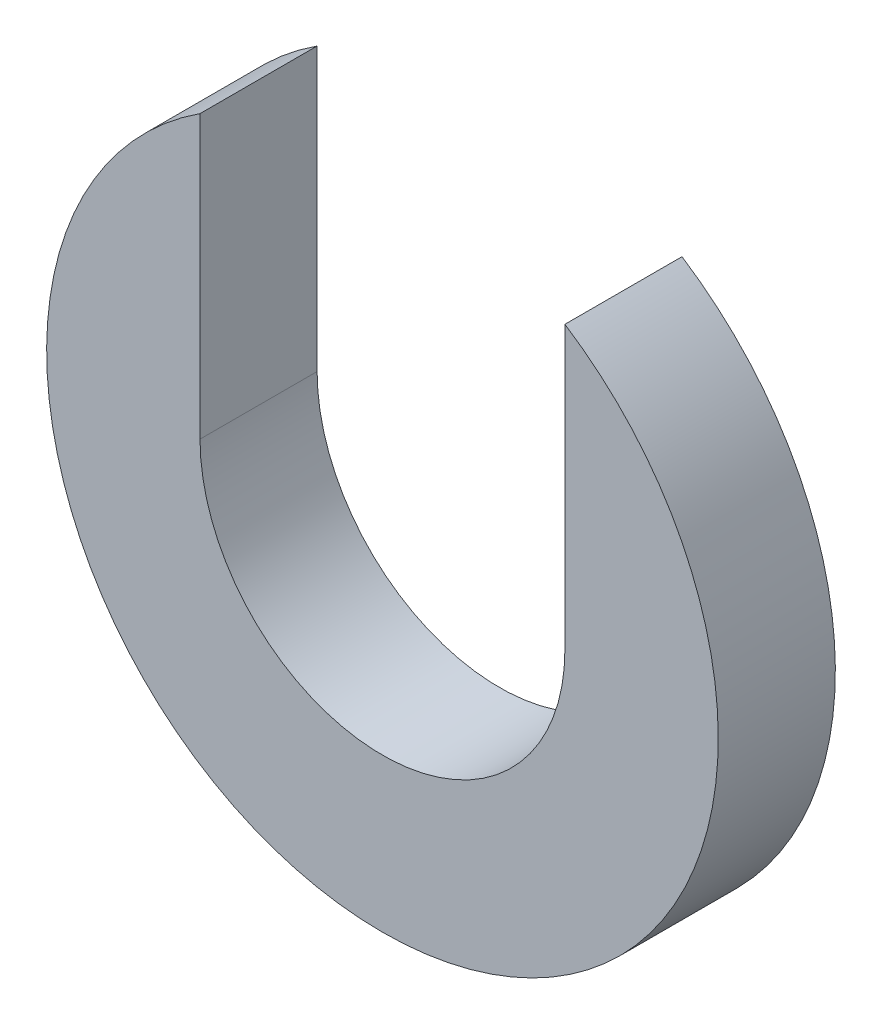
ISO-10303-21;
HEADER;
FILE_DESCRIPTION(('STEP AP214'),'2;1');
FILE_NAME('part.step','',(''),(''),'','','');
FILE_SCHEMA(('AUTOMOTIVE_DESIGN { 1 0 10303 214 1 1 1 1 }'));
ENDSEC;
DATA;
#1=APPLICATION_CONTEXT('core data for automotive mechanical design processes');
#2=APPLICATION_PROTOCOL_DEFINITION('international standard','automotive_design',2000,#1);
#3=PRODUCT_CONTEXT('',#1,'mechanical');
#4=PRODUCT('Part','Part','',(#3));
#5=PRODUCT_RELATED_PRODUCT_CATEGORY('part','',(#4));
#6=PRODUCT_DEFINITION_FORMATION('','',#4);
#7=PRODUCT_DEFINITION_CONTEXT('part definition',#1,'design');
#8=PRODUCT_DEFINITION('design','',#6,#7);
#9=PRODUCT_DEFINITION_SHAPE('','',#8);
#10=(LENGTH_UNIT() NAMED_UNIT(*) SI_UNIT(.MILLI.,.METRE.));
#11=(NAMED_UNIT(*) PLANE_ANGLE_UNIT() SI_UNIT($,.RADIAN.));
#12=(NAMED_UNIT(*) SI_UNIT($,.STERADIAN.) SOLID_ANGLE_UNIT());
#13=UNCERTAINTY_MEASURE_WITH_UNIT(LENGTH_MEASURE(1.E-05),#10,'distance_accuracy_value','');
#14=(GEOMETRIC_REPRESENTATION_CONTEXT(3) GLOBAL_UNCERTAINTY_ASSIGNED_CONTEXT((#13)) GLOBAL_UNIT_ASSIGNED_CONTEXT((#10,
#11,#12)) REPRESENTATION_CONTEXT('',''));
#15=CARTESIAN_POINT('',(0.,0.,0.));
#16=DIRECTION('',(0.,0.,1.));
#17=DIRECTION('',(1.,0.,0.));
#18=AXIS2_PLACEMENT_3D('',#15,#16,#17);
#19=CARTESIAN_POINT('',(0.,0.,3.18));
#20=DIRECTION('',(0.,0.,-1.));
#21=DIRECTION('',(-1.,0.,0.));
#22=AXIS2_PLACEMENT_3D('',#19,#20,#21);
#23=CYLINDRICAL_SURFACE('',#22,9.12);
#24=CARTESIAN_POINT('',(0.,0.,3.18));
#25=DIRECTION('',(0.,0.,1.));
#26=DIRECTION('',(1.,0.,0.));
#27=AXIS2_PLACEMENT_3D('',#24,#25,#26);
#28=CIRCLE('',#27,9.12);
#29=CARTESIAN_POINT('',(-4.955,7.6565249950614,3.18));
#30=VERTEX_POINT('',#29);
#31=CARTESIAN_POINT('',(4.955,7.6565249950614,3.18));
#32=VERTEX_POINT('',#31);
#33=EDGE_CURVE('E11',#30,#32,#28,.T.);
#34=ORIENTED_EDGE('',*,*,#33,.F.);
#35=DIRECTION('',(0.,0.,1.));
#36=VECTOR('',#35,1.);
#37=CARTESIAN_POINT('',(-4.955,7.6565249950614,0.));
#38=LINE('',#37,#36);
#39=CARTESIAN_POINT('',(-4.955,7.6565249950614,0.));
#40=VERTEX_POINT('',#39);
#41=EDGE_CURVE('E66',#40,#30,#38,.T.);
#42=ORIENTED_EDGE('',*,*,#41,.F.);
#43=CARTESIAN_POINT('',(0.,0.,0.));
#44=DIRECTION('',(0.,0.,1.));
#45=DIRECTION('',(1.,0.,0.));
#46=AXIS2_PLACEMENT_3D('',#43,#44,#45);
#47=CIRCLE('',#46,9.12);
#48=CARTESIAN_POINT('',(4.955,7.6565249950614,0.));
#49=VERTEX_POINT('',#48);
#50=EDGE_CURVE('E43',#40,#49,#47,.T.);
#51=ORIENTED_EDGE('',*,*,#50,.T.);
#52=DIRECTION('',(0.,0.,1.));
#53=VECTOR('',#52,1.);
#54=CARTESIAN_POINT('',(4.955,7.6565249950614,0.));
#55=LINE('',#54,#53);
#56=EDGE_CURVE('E52',#49,#32,#55,.T.);
#57=ORIENTED_EDGE('',*,*,#56,.T.);
#58=EDGE_LOOP('',(#34,#42,#51,#57));
#59=FACE_BOUND('',#58,.T.);
#60=ADVANCED_FACE('F34',(#59),#23,.T.);
#61=CARTESIAN_POINT('',(0.,0.,3.18));
#62=DIRECTION('',(0.,0.,1.));
#63=DIRECTION('',(1.,0.,0.));
#64=AXIS2_PLACEMENT_3D('',#61,#62,#63);
#65=PLANE('',#64);
#66=DIRECTION('',(0.,1.,0.));
#67=VECTOR('',#66,1.);
#68=CARTESIAN_POINT('',(-4.955,0.,3.18));
#69=LINE('',#68,#67);
#70=CARTESIAN_POINT('',(-4.955,0.,3.18));
#71=VERTEX_POINT('',#70);
#72=EDGE_CURVE('E70',#30,#71,#69,.F.);
#73=ORIENTED_EDGE('',*,*,#72,.F.);
#74=ORIENTED_EDGE('',*,*,#33,.T.);
#75=DIRECTION('',(0.,1.,0.));
#76=VECTOR('',#75,1.);
#77=CARTESIAN_POINT('',(4.955,0.,3.18));
#78=LINE('',#77,#76);
#79=CARTESIAN_POINT('',(4.955,0.,3.18));
#80=VERTEX_POINT('',#79);
#81=EDGE_CURVE('E86',#80,#32,#78,.T.);
#82=ORIENTED_EDGE('',*,*,#81,.F.);
#83=CARTESIAN_POINT('',(0.,0.,3.18));
#84=DIRECTION('',(0.,0.,1.));
#85=DIRECTION('',(1.,0.,0.));
#86=AXIS2_PLACEMENT_3D('',#83,#84,#85);
#87=CIRCLE('',#86,4.955);
#88=EDGE_CURVE('E37',#71,#80,#87,.T.);
#89=ORIENTED_EDGE('',*,*,#88,.F.);
#90=EDGE_LOOP('',(#73,#74,#82,#89));
#91=FACE_BOUND('',#90,.T.);
#92=ADVANCED_FACE('F83',(#91),#65,.T.);
#93=CARTESIAN_POINT('',(0.,0.,0.));
#94=DIRECTION('',(0.,0.,1.));
#95=DIRECTION('',(1.,0.,0.));
#96=AXIS2_PLACEMENT_3D('',#93,#94,#95);
#97=PLANE('',#96);
#98=ORIENTED_EDGE('',*,*,#50,.F.);
#99=DIRECTION('',(0.,-1.,0.));
#100=VECTOR('',#99,1.);
#101=CARTESIAN_POINT('',(-4.955,0.,0.));
#102=LINE('',#101,#100);
#103=CARTESIAN_POINT('',(-4.955,0.,0.));
#104=VERTEX_POINT('',#103);
#105=EDGE_CURVE('E74',#40,#104,#102,.T.);
#106=ORIENTED_EDGE('',*,*,#105,.T.);
#107=CARTESIAN_POINT('',(0.,0.,0.));
#108=DIRECTION('',(0.,0.,1.));
#109=DIRECTION('',(1.,0.,0.));
#110=AXIS2_PLACEMENT_3D('',#107,#108,#109);
#111=CIRCLE('',#110,4.955);
#112=CARTESIAN_POINT('',(4.955,0.,0.));
#113=VERTEX_POINT('',#112);
#114=EDGE_CURVE('E100',#104,#113,#111,.T.);
#115=ORIENTED_EDGE('',*,*,#114,.T.);
#116=DIRECTION('',(0.,1.,0.));
#117=VECTOR('',#116,1.);
#118=CARTESIAN_POINT('',(4.955,0.,0.));
#119=LINE('',#118,#117);
#120=EDGE_CURVE('E98',#113,#49,#119,.T.);
#121=ORIENTED_EDGE('',*,*,#120,.T.);
#122=EDGE_LOOP('',(#98,#106,#115,#121));
#123=FACE_BOUND('',#122,.T.);
#124=ADVANCED_FACE('F104',(#123),#97,.F.);
#125=CARTESIAN_POINT('',(0.,0.,0.));
#126=DIRECTION('',(0.,0.,1.));
#127=DIRECTION('',(1.,0.,0.));
#128=AXIS2_PLACEMENT_3D('',#125,#126,#127);
#129=CYLINDRICAL_SURFACE('',#128,4.955);
#130=ORIENTED_EDGE('',*,*,#88,.T.);
#131=DIRECTION('',(0.,0.,1.));
#132=VECTOR('',#131,1.);
#133=CARTESIAN_POINT('',(4.955,0.,0.));
#134=LINE('',#133,#132);
#135=EDGE_CURVE('E87',#113,#80,#134,.T.);
#136=ORIENTED_EDGE('',*,*,#135,.F.);
#137=ORIENTED_EDGE('',*,*,#114,.F.);
#138=DIRECTION('',(0.,0.,1.));
#139=VECTOR('',#138,1.);
#140=CARTESIAN_POINT('',(-4.955,0.,0.));
#141=LINE('',#140,#139);
#142=EDGE_CURVE('E79',#104,#71,#141,.T.);
#143=ORIENTED_EDGE('',*,*,#142,.T.);
#144=EDGE_LOOP('',(#130,#136,#137,#143));
#145=FACE_BOUND('',#144,.T.);
#146=ADVANCED_FACE('F107',(#145),#129,.F.);
#147=CARTESIAN_POINT('',(-4.955,0.,0.));
#148=DIRECTION('',(-1.,0.,0.));
#149=DIRECTION('',(0.,0.,1.));
#150=AXIS2_PLACEMENT_3D('',#147,#148,#149);
#151=PLANE('',#150);
#152=ORIENTED_EDGE('',*,*,#72,.T.);
#153=ORIENTED_EDGE('',*,*,#142,.F.);
#154=ORIENTED_EDGE('',*,*,#105,.F.);
#155=ORIENTED_EDGE('',*,*,#41,.T.);
#156=EDGE_LOOP('',(#152,#153,#154,#155));
#157=FACE_BOUND('',#156,.T.);
#158=ADVANCED_FACE('F68',(#157),#151,.F.);
#159=CARTESIAN_POINT('',(4.955,0.,0.));
#160=DIRECTION('',(1.,0.,0.));
#161=DIRECTION('',(0.,0.,-1.));
#162=AXIS2_PLACEMENT_3D('',#159,#160,#161);
#163=PLANE('',#162);
#164=ORIENTED_EDGE('',*,*,#81,.T.);
#165=ORIENTED_EDGE('',*,*,#56,.F.);
#166=ORIENTED_EDGE('',*,*,#120,.F.);
#167=ORIENTED_EDGE('',*,*,#135,.T.);
#168=EDGE_LOOP('',(#164,#165,#166,#167));
#169=FACE_BOUND('',#168,.T.);
#170=ADVANCED_FACE('F108',(#169),#163,.F.);
#171=CLOSED_SHELL('',(#60,#92,#124,#146,#158,#170));
#172=MANIFOLD_SOLID_BREP('B2',#171);
#173=ADVANCED_BREP_SHAPE_REPRESENTATION('',(#18,#172),#14);
#174=SHAPE_DEFINITION_REPRESENTATION(#9,#173);
ENDSEC;
END-ISO-10303-21;
